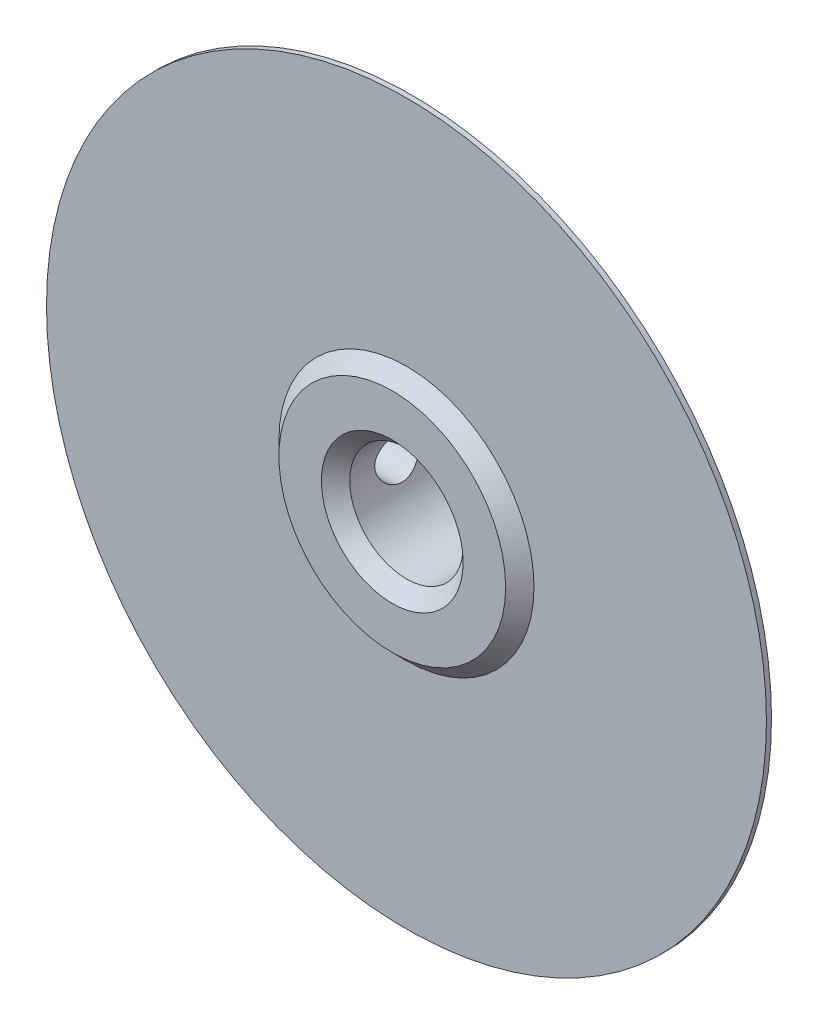
ISO-10303-21;
HEADER;
FILE_DESCRIPTION(('STEP AP214'),'2;1');
FILE_NAME('part.step','',(''),(''),'','','');
FILE_SCHEMA(('AUTOMOTIVE_DESIGN { 1 0 10303 214 1 1 1 1 }'));
ENDSEC;
DATA;
#1=APPLICATION_CONTEXT('core data for automotive mechanical design processes');
#2=APPLICATION_PROTOCOL_DEFINITION('international standard','automotive_design',2000,#1);
#3=PRODUCT_CONTEXT('',#1,'mechanical');
#4=PRODUCT('Part','Part','',(#3));
#5=PRODUCT_RELATED_PRODUCT_CATEGORY('part','',(#4));
#6=PRODUCT_DEFINITION_FORMATION('','',#4);
#7=PRODUCT_DEFINITION_CONTEXT('part definition',#1,'design');
#8=PRODUCT_DEFINITION('design','',#6,#7);
#9=PRODUCT_DEFINITION_SHAPE('','',#8);
#10=(LENGTH_UNIT() NAMED_UNIT(*) SI_UNIT(.MILLI.,.METRE.));
#11=(NAMED_UNIT(*) PLANE_ANGLE_UNIT() SI_UNIT($,.RADIAN.));
#12=(NAMED_UNIT(*) SI_UNIT($,.STERADIAN.) SOLID_ANGLE_UNIT());
#13=UNCERTAINTY_MEASURE_WITH_UNIT(LENGTH_MEASURE(1.E-05),#10,'distance_accuracy_value','');
#14=(GEOMETRIC_REPRESENTATION_CONTEXT(3) GLOBAL_UNCERTAINTY_ASSIGNED_CONTEXT((#13)) GLOBAL_UNIT_ASSIGNED_CONTEXT((#10,
#11,#12)) REPRESENTATION_CONTEXT('',''));
#15=CARTESIAN_POINT('',(0.,0.,0.));
#16=DIRECTION('',(0.,0.,1.));
#17=DIRECTION('',(1.,0.,0.));
#18=AXIS2_PLACEMENT_3D('',#15,#16,#17);
#19=CARTESIAN_POINT('',(0.,0.,0.18));
#20=DIRECTION('',(0.,0.,1.));
#21=DIRECTION('',(1.,0.,0.));
#22=AXIS2_PLACEMENT_3D('',#19,#20,#21);
#23=PLANE('',#22);
#24=CARTESIAN_POINT('',(0.,0.,0.18));
#25=DIRECTION('',(0.,0.,1.));
#26=DIRECTION('',(1.,0.,0.));
#27=AXIS2_PLACEMENT_3D('',#24,#25,#26);
#28=CIRCLE('',#27,12.7);
#29=CARTESIAN_POINT('',(-12.7,0.,0.18));
#30=VERTEX_POINT('',#29);
#31=EDGE_CURVE('E97',#30,#30,#28,.T.);
#32=ORIENTED_EDGE('',*,*,#31,.T.);
#33=EDGE_LOOP('',(#32));
#34=FACE_BOUND('',#33,.T.);
#35=CARTESIAN_POINT('',(0.,0.,0.18));
#36=DIRECTION('',(0.,0.,1.));
#37=DIRECTION('',(1.,0.,0.));
#38=AXIS2_PLACEMENT_3D('',#35,#36,#37);
#39=CIRCLE('',#38,4.5);
#40=CARTESIAN_POINT('',(4.5,0.,0.18));
#41=VERTEX_POINT('',#40);
#42=EDGE_CURVE('E75',#41,#41,#39,.T.);
#43=ORIENTED_EDGE('',*,*,#42,.F.);
#44=EDGE_LOOP('',(#43));
#45=FACE_BOUND('',#44,.T.);
#46=ADVANCED_FACE('F36',(#34,#45),#23,.T.);
#47=CARTESIAN_POINT('',(0.,0.,0.));
#48=DIRECTION('',(0.,0.,1.));
#49=DIRECTION('',(1.,0.,0.));
#50=AXIS2_PLACEMENT_3D('',#47,#48,#49);
#51=PLANE('',#50);
#52=CARTESIAN_POINT('',(0.,0.,0.));
#53=DIRECTION('',(0.,0.,1.));
#54=DIRECTION('',(1.,0.,0.));
#55=AXIS2_PLACEMENT_3D('',#52,#53,#54);
#56=CIRCLE('',#55,12.7);
#57=CARTESIAN_POINT('',(-12.7,0.,0.));
#58=VERTEX_POINT('',#57);
#59=EDGE_CURVE('E96',#58,#58,#56,.T.);
#60=ORIENTED_EDGE('',*,*,#59,.F.);
#61=EDGE_LOOP('',(#60));
#62=FACE_BOUND('',#61,.T.);
#63=CARTESIAN_POINT('',(0.,0.,0.));
#64=DIRECTION('',(0.,0.,1.));
#65=DIRECTION('',(1.,0.,0.));
#66=AXIS2_PLACEMENT_3D('',#63,#64,#65);
#67=CIRCLE('',#66,3.6);
#68=CARTESIAN_POINT('',(3.6,0.,0.));
#69=VERTEX_POINT('',#68);
#70=EDGE_CURVE('E65',#69,#69,#67,.F.);
#71=ORIENTED_EDGE('',*,*,#70,.F.);
#72=EDGE_LOOP('',(#71));
#73=FACE_BOUND('',#72,.T.);
#74=ADVANCED_FACE('F106',(#62,#73),#51,.F.);
#75=CARTESIAN_POINT('',(0.,0.,0.18));
#76=DIRECTION('',(0.,0.,-1.));
#77=DIRECTION('',(-1.,0.,0.));
#78=AXIS2_PLACEMENT_3D('',#75,#76,#77);
#79=CYLINDRICAL_SURFACE('',#78,12.7);
#80=CARTESIAN_POINT('',(-12.7,0.,0.18));
#81=CARTESIAN_POINT('',(-12.7,0.,0.178125));
#82=CARTESIAN_POINT('',(-12.7,0.,0.17625));
#83=CARTESIAN_POINT('',(-12.7,0.,0.1725));
#84=CARTESIAN_POINT('',(-12.7,0.,0.170625));
#85=CARTESIAN_POINT('',(-12.7,0.,0.166875));
#86=CARTESIAN_POINT('',(-12.7,0.,0.165));
#87=CARTESIAN_POINT('',(-12.7,0.,0.16125));
#88=CARTESIAN_POINT('',(-12.7,0.,0.159375));
#89=CARTESIAN_POINT('',(-12.7,0.,0.155625));
#90=CARTESIAN_POINT('',(-12.7,0.,0.15375));
#91=CARTESIAN_POINT('',(-12.7,0.,0.15));
#92=CARTESIAN_POINT('',(-12.7,0.,0.148125));
#93=CARTESIAN_POINT('',(-12.7,0.,0.144375));
#94=CARTESIAN_POINT('',(-12.7,0.,0.1425));
#95=CARTESIAN_POINT('',(-12.7,0.,0.13875));
#96=CARTESIAN_POINT('',(-12.7,0.,0.136875));
#97=CARTESIAN_POINT('',(-12.7,0.,0.133125));
#98=CARTESIAN_POINT('',(-12.7,0.,0.13125));
#99=CARTESIAN_POINT('',(-12.7,0.,0.1275));
#100=CARTESIAN_POINT('',(-12.7,0.,0.125625));
#101=CARTESIAN_POINT('',(-12.7,0.,0.121875));
#102=CARTESIAN_POINT('',(-12.7,0.,0.12));
#103=CARTESIAN_POINT('',(-12.7,0.,0.11625));
#104=CARTESIAN_POINT('',(-12.7,0.,0.114375));
#105=CARTESIAN_POINT('',(-12.7,0.,0.110625));
#106=CARTESIAN_POINT('',(-12.7,0.,0.10875));
#107=CARTESIAN_POINT('',(-12.7,0.,0.105));
#108=CARTESIAN_POINT('',(-12.7,0.,0.103125));
#109=CARTESIAN_POINT('',(-12.7,0.,0.099375));
#110=CARTESIAN_POINT('',(-12.7,0.,0.0975));
#111=CARTESIAN_POINT('',(-12.7,0.,0.09375));
#112=CARTESIAN_POINT('',(-12.7,0.,0.091875));
#113=CARTESIAN_POINT('',(-12.7,0.,0.088125));
#114=CARTESIAN_POINT('',(-12.7,0.,0.08625));
#115=CARTESIAN_POINT('',(-12.7,0.,0.0825));
#116=CARTESIAN_POINT('',(-12.7,0.,0.080625));
#117=CARTESIAN_POINT('',(-12.7,0.,0.076875));
#118=CARTESIAN_POINT('',(-12.7,0.,0.075));
#119=CARTESIAN_POINT('',(-12.7,0.,0.07125));
#120=CARTESIAN_POINT('',(-12.7,0.,0.069375));
#121=CARTESIAN_POINT('',(-12.7,0.,0.065625));
#122=CARTESIAN_POINT('',(-12.7,0.,0.06375));
#123=CARTESIAN_POINT('',(-12.7,0.,0.06));
#124=CARTESIAN_POINT('',(-12.7,0.,0.058125));
#125=CARTESIAN_POINT('',(-12.7,0.,0.054375));
#126=CARTESIAN_POINT('',(-12.7,0.,0.0525));
#127=CARTESIAN_POINT('',(-12.7,0.,0.04875));
#128=CARTESIAN_POINT('',(-12.7,0.,0.046875));
#129=CARTESIAN_POINT('',(-12.7,0.,0.043125));
#130=CARTESIAN_POINT('',(-12.7,0.,0.04125));
#131=CARTESIAN_POINT('',(-12.7,0.,0.0375));
#132=CARTESIAN_POINT('',(-12.7,0.,0.035625));
#133=CARTESIAN_POINT('',(-12.7,0.,0.031875));
#134=CARTESIAN_POINT('',(-12.7,0.,0.03));
#135=CARTESIAN_POINT('',(-12.7,0.,0.02625));
#136=CARTESIAN_POINT('',(-12.7,0.,0.024375));
#137=CARTESIAN_POINT('',(-12.7,0.,0.020625));
#138=CARTESIAN_POINT('',(-12.7,0.,0.01875));
#139=CARTESIAN_POINT('',(-12.7,0.,0.015));
#140=CARTESIAN_POINT('',(-12.7,0.,0.013125));
#141=CARTESIAN_POINT('',(-12.7,0.,0.00937499999999997));
#142=CARTESIAN_POINT('',(-12.7,0.,0.00749999999999997));
#143=CARTESIAN_POINT('',(-12.7,0.,0.00374999999999996));
#144=CARTESIAN_POINT('',(-12.7,0.,0.00187499999999997));
#145=CARTESIAN_POINT('',(-12.7,0.,0.));
#146=B_SPLINE_CURVE_WITH_KNOTS('',3,(#80,#81,#82,#83,#84,#85,#86,#87,#88,#89,#90,#91,#92,#93,
#94,#95,#96,#97,#98,#99,#100,#101,#102,#103,#104,#105,#106,#107,#108,#109,#110,#111,#112,#113,
#114,#115,#116,#117,#118,#119,#120,#121,#122,#123,#124,#125,#126,#127,#128,#129,#130,#131,#132,
#133,#134,#135,#136,#137,#138,#139,#140,#141,#142,#143,#144,#145),.UNSPECIFIED.,.F.,.F.,(4,2,2,
2,2,2,2,2,2,2,2,2,2,2,2,2,2,2,2,2,2,2,2,2,2,2,2,2,2,2,2,2,4),(0.,0.00562500000000001,0.01125,
0.016875,0.0225,0.028125,0.03375,0.039375,0.045,0.050625,0.05625,0.061875,0.0675,0.073125,
0.07875,0.084375,0.09,0.095625,0.10125,0.106875,0.1125,0.118125,0.12375,0.129375,0.135,0.140625,
0.14625,0.151875,0.1575,0.163125,0.16875,0.174375,0.18),.UNSPECIFIED.);
#147=EDGE_CURVE('BSEAM103',#30,#58,#146,.T.);
#148=ORIENTED_EDGE('',*,*,#31,.F.);
#149=ORIENTED_EDGE('',*,*,#59,.T.);
#150=ORIENTED_EDGE('',*,*,#147,.T.);
#151=ORIENTED_EDGE('',*,*,#147,.F.);
#152=EDGE_LOOP('',(#148,#150,#149,#151));
#153=FACE_BOUND('',#152,.T.);
#154=ADVANCED_FACE('F103',(#153),#79,.T.);
#155=CARTESIAN_POINT('',(0.,0.,0.18));
#156=DIRECTION('',(0.,0.,-1.));
#157=DIRECTION('',(-1.,0.,0.));
#158=AXIS2_PLACEMENT_3D('',#155,#156,#157);
#159=CYLINDRICAL_SURFACE('',#158,2.);
#160=CARTESIAN_POINT('',(0.,0.,0.179999999999991));
#161=DIRECTION('',(0.,0.,1.));
#162=DIRECTION('',(1.,0.,0.));
#163=AXIS2_PLACEMENT_3D('',#160,#161,#162);
#164=CIRCLE('',#163,2.);
#165=CARTESIAN_POINT('',(2.,0.,0.179999999999991));
#166=VERTEX_POINT('',#165);
#167=EDGE_CURVE('E43',#166,#166,#164,.T.);
#168=ORIENTED_EDGE('',*,*,#167,.T.);
#169=EDGE_LOOP('',(#168));
#170=FACE_BOUND('',#169,.T.);
#171=CARTESIAN_POINT('',(0.,0.,-2.5));
#172=DIRECTION('',(0.,0.,-1.));
#173=DIRECTION('',(-1.,0.,0.));
#174=AXIS2_PLACEMENT_3D('',#171,#172,#173);
#175=CIRCLE('',#174,2.);
#176=CARTESIAN_POINT('',(-2.,0.,-2.5));
#177=VERTEX_POINT('',#176);
#178=EDGE_CURVE('E62',#177,#177,#175,.T.);
#179=ORIENTED_EDGE('',*,*,#178,.T.);
#180=EDGE_LOOP('',(#179));
#181=FACE_BOUND('',#180,.T.);
#182=CARTESIAN_POINT('',(-2.,0.,-0.7));
#183=CARTESIAN_POINT('',(-1.99999708490834,-0.0429972021771565,-0.70000394072949));
#184=CARTESIAN_POINT('',(-1.99859717722773,-0.0860690256362693,-0.70348710083535));
#185=CARTESIAN_POINT('',(-1.99313381240257,-0.170998592167158,-0.717299081408494));
#186=CARTESIAN_POINT('',(-1.98906311479551,-0.212852711024499,-0.727646511634453));
#187=CARTESIAN_POINT('',(-1.97869683685247,-0.293981569090961,-0.754750431223532));
#188=CARTESIAN_POINT('',(-1.97240854545629,-0.333264264646783,-0.771485938486692));
#189=CARTESIAN_POINT('',(-1.95822644318431,-0.408428788131347,-0.810807669330618));
#190=CARTESIAN_POINT('',(-1.95033318983223,-0.444311790700397,-0.833391861967572));
#191=CARTESIAN_POINT('',(-1.93332354468167,-0.513400403028157,-0.884894199424375));
#192=CARTESIAN_POINT('',(-1.92416918771676,-0.546424909020085,-0.914042662496106));
#193=CARTESIAN_POINT('',(-1.90584230762478,-0.607270001913889,-0.977360001390711));
#194=CARTESIAN_POINT('',(-1.89666977781517,-0.635088042853413,-1.0115313188847));
#195=CARTESIAN_POINT('',(-1.87889116718855,-0.685949826917151,-1.08577122809691));
#196=CARTESIAN_POINT('',(-1.87032846385981,-0.708725992478189,-1.12603459440928));
#197=CARTESIAN_POINT('',(-1.85533458874717,-0.747101887614859,-1.21021455936802));
#198=CARTESIAN_POINT('',(-1.8489024049767,-0.762705025714334,-1.25412941113934));
#199=CARTESIAN_POINT('',(-1.83930543064327,-0.785559529358347,-1.34228493343684));
#200=CARTESIAN_POINT('',(-1.83600568142242,-0.793157586322259,-1.38642049423048));
#201=CARTESIAN_POINT('',(-1.83265601619658,-0.800869184656011,-1.47545399932291));
#202=CARTESIAN_POINT('',(-1.83260450209107,-0.800986406525289,-1.52035155785001));
#203=CARTESIAN_POINT('',(-1.83564200111998,-0.793995747001818,-1.60630266858322));
#204=CARTESIAN_POINT('',(-1.8385127001538,-0.787390125722055,-1.64740628576361));
#205=CARTESIAN_POINT('',(-1.84670475043134,-0.767978752119128,-1.72786382240269));
#206=CARTESIAN_POINT('',(-1.85202652928669,-0.755171917921852,-1.76721743524412));
#207=CARTESIAN_POINT('',(-1.86463794035412,-0.723477893020429,-1.84400713447842));
#208=CARTESIAN_POINT('',(-1.87196551712315,-0.704471944926127,-1.88138769562188));
#209=CARTESIAN_POINT('',(-1.88775246555956,-0.661002584292885,-1.95256632654463));
#210=CARTESIAN_POINT('',(-1.89621226182739,-0.636537122040337,-1.98636304376112));
#211=CARTESIAN_POINT('',(-1.91410694696908,-0.580620239781773,-2.0521638915208));
#212=CARTESIAN_POINT('',(-1.92356665990461,-0.548774985188254,-2.08382749177841));
#213=CARTESIAN_POINT('',(-1.94183929983313,-0.480125770972077,-2.14147379120082));
#214=CARTESIAN_POINT('',(-1.9506520977813,-0.443320826133773,-2.16745535896412));
#215=CARTESIAN_POINT('',(-1.96685872505819,-0.364831061042337,-2.21344697896633));
#216=CARTESIAN_POINT('',(-1.97422108038166,-0.323064196538591,-2.23332891247882));
#217=CARTESIAN_POINT('',(-1.98645931331504,-0.236409506193153,-2.26566714443122));
#218=CARTESIAN_POINT('',(-1.99133645384953,-0.19152327873987,-2.27812721502296));
#219=CARTESIAN_POINT('',(-1.99782455802764,-0.102758355043128,-2.29457931816788));
#220=CARTESIAN_POINT('',(-1.99961178333406,-0.0589773175942141,-2.29902898170142));
#221=CARTESIAN_POINT('',(-2.00027391404252,0.0287381239231266,-2.30068524021145));
#222=CARTESIAN_POINT('',(-1.99914957432917,0.0726724852895693,-2.297893712619));
#223=CARTESIAN_POINT('',(-1.99423026825501,0.157373095648795,-2.2854832989792));
#224=CARTESIAN_POINT('',(-1.99055756538209,0.198192996710189,-2.27617680785961));
#225=CARTESIAN_POINT('',(-1.981037765622,0.277654171224312,-2.25142571667607));
#226=CARTESIAN_POINT('',(-1.97519038942612,0.316295164089937,-2.23598032813253));
#227=CARTESIAN_POINT('',(-1.96166637908325,0.391631514326681,-2.19888602412802));
#228=CARTESIAN_POINT('',(-1.95393926391921,0.428231209102162,-2.17706181118274));
#229=CARTESIAN_POINT('',(-1.9374934589821,0.497377436498622,-2.12802387043774));
#230=CARTESIAN_POINT('',(-1.92877437244108,0.52992233630445,-2.10080798283095));
#231=CARTESIAN_POINT('',(-1.91058047055245,0.592289217211527,-2.03965199482015));
#232=CARTESIAN_POINT('',(-1.90109376570021,0.621789573522426,-2.00538658339752));
#233=CARTESIAN_POINT('',(-1.88296669166853,0.674700478965484,-1.93222396679625));
#234=CARTESIAN_POINT('',(-1.87432646210604,0.698110024535003,-1.89332599986402));
#235=CARTESIAN_POINT('',(-1.85885719963083,0.738323000772651,-1.81141532216236));
#236=CARTESIAN_POINT('',(-1.85204652353915,0.755060237813781,-1.76836640031508));
#237=CARTESIAN_POINT('',(-1.84129469391173,0.780918487882122,-1.67970653931394));
#238=CARTESIAN_POINT('',(-1.83735142278399,0.790045122107726,-1.63409751767503));
#239=CARTESIAN_POINT('',(-1.83308703719971,0.79988624691136,-1.54514883929018));
#240=CARTESIAN_POINT('',(-1.83252568403269,0.801158832921147,-1.50188206416266));
#241=CARTESIAN_POINT('',(-1.83445934413239,0.796721263711009,-1.41578205691468));
#242=CARTESIAN_POINT('',(-1.83695396929917,0.791011995165513,-1.37294877043897));
#243=CARTESIAN_POINT('',(-1.84450659631608,0.773228546461459,-1.29066712405798));
#244=CARTESIAN_POINT('',(-1.8494593273098,0.761414997428391,-1.2511518902268));
#245=CARTESIAN_POINT('',(-1.86129600493079,0.732002179396405,-1.17464854815461));
#246=CARTESIAN_POINT('',(-1.86818048482403,0.714401312557525,-1.13766114124007));
#247=CARTESIAN_POINT('',(-1.88359443841797,0.672749105103892,-1.06495615229169));
#248=CARTESIAN_POINT('',(-1.89219552925297,0.648386134063796,-1.02943253194781));
#249=CARTESIAN_POINT('',(-1.90985521748895,0.594356847708598,-0.962802673118498));
#250=CARTESIAN_POINT('',(-1.91891395219363,0.564688933927249,-0.931697771148674));
#251=CARTESIAN_POINT('',(-1.93717426834958,0.498602202508985,-0.872718858694554));
#252=CARTESIAN_POINT('',(-1.94634703184874,0.461870400458455,-0.845185077240773));
#253=CARTESIAN_POINT('',(-1.96320162685487,0.383960128114312,-0.796665182951346));
#254=CARTESIAN_POINT('',(-1.97088276437162,0.342779601818895,-0.775682115138989));
#255=CARTESIAN_POINT('',(-1.98375885926344,0.257895224998081,-0.741351113923884));
#256=CARTESIAN_POINT('',(-1.98899745222011,0.214252647287879,-0.727868270575865));
#257=CARTESIAN_POINT('',(-1.99657722483746,0.125150618512488,-0.708544351618293));
#258=CARTESIAN_POINT('',(-1.99892759798255,0.0796974103435651,-0.70267902530244));
#259=CARTESIAN_POINT('',(-1.99990359801655,0.0227649191563719,-0.70024184760869));
#260=CARTESIAN_POINT('',(-2.0000007718767,0.0113850754963034,-0.699998956548322));
#261=CARTESIAN_POINT('',(-2.,0.,-0.7));
#262=B_SPLINE_CURVE_WITH_KNOTS('',3,(#182,#183,#184,#185,#186,#187,#188,#189,#190,#191,#192,
#193,#194,#195,#196,#197,#198,#199,#200,#201,#202,#203,#204,#205,#206,#207,#208,#209,#210,#211,
#212,#213,#214,#215,#216,#217,#218,#219,#220,#221,#222,#223,#224,#225,#226,#227,#228,#229,#230,
#231,#232,#233,#234,#235,#236,#237,#238,#239,#240,#241,#242,#243,#244,#245,#246,#247,#248,#249,
#250,#251,#252,#253,#254,#255,#256,#257,#258,#259,#260,#261),.UNSPECIFIED.,.T.,.F.,(4,2,2,2,2,2,
2,2,2,2,2,2,2,2,2,2,2,2,2,2,2,2,2,2,2,2,2,2,2,2,2,2,2,2,2,2,2,2,2,4),(0.,0.128961195157228,
0.258273454403174,0.387164582988632,0.516011014271937,0.650389526801588,0.784833579737646,
0.925261035276867,1.06562169247307,1.19961642123531,1.33354522536195,1.45815331360549,
1.58278314902419,1.70995650519526,1.83717768775273,1.97423339674623,2.11131637135893,
2.25110765265123,2.39082782445516,2.52227673811203,2.65369157428033,2.77920182225746,
2.90472819597519,3.03409405359305,3.16351183799588,3.30147389849765,3.43945867617499,
3.57878018056331,3.71799869058374,3.84719869357099,3.97638229025218,4.10045727419508,
4.22456654322065,4.35578187222677,4.48703680539357,4.62680169413534,4.76663145456213,
4.90385720405328,5.04064500961737,5.07479218358718),.UNSPECIFIED.);
#263=CARTESIAN_POINT('',(-2.,0.,-0.7));
#264=VERTEX_POINT('',#263);
#265=EDGE_CURVE('E74',#264,#264,#262,.T.);
#266=ORIENTED_EDGE('',*,*,#265,.F.);
#267=EDGE_LOOP('',(#266));
#268=FACE_BOUND('',#267,.T.);
#269=ADVANCED_FACE('F99',(#170,#181,#268),#159,.F.);
#270=CARTESIAN_POINT('',(0.,0.,-3.));
#271=DIRECTION('',(0.,0.,-1.));
#272=DIRECTION('',(-1.,0.,0.));
#273=AXIS2_PLACEMENT_3D('',#270,#271,#272);
#274=PLANE('',#273);
#275=CARTESIAN_POINT('',(0.,0.,-3.));
#276=DIRECTION('',(0.,0.,-1.));
#277=DIRECTION('',(-1.,0.,0.));
#278=AXIS2_PLACEMENT_3D('',#275,#276,#277);
#279=CIRCLE('',#278,2.50000000000001);
#280=CARTESIAN_POINT('',(-2.50000000000001,0.,-3.));
#281=VERTEX_POINT('',#280);
#282=EDGE_CURVE('E56',#281,#281,#279,.F.);
#283=ORIENTED_EDGE('',*,*,#282,.T.);
#284=EDGE_LOOP('',(#283));
#285=FACE_BOUND('',#284,.T.);
#286=CARTESIAN_POINT('',(0.,0.,-3.));
#287=DIRECTION('',(0.,0.,-1.));
#288=DIRECTION('',(-1.,0.,0.));
#289=AXIS2_PLACEMENT_3D('',#286,#287,#288);
#290=CIRCLE('',#289,3.1);
#291=CARTESIAN_POINT('',(-3.1,0.,-3.));
#292=VERTEX_POINT('',#291);
#293=EDGE_CURVE('E59',#292,#292,#290,.T.);
#294=ORIENTED_EDGE('',*,*,#293,.T.);
#295=EDGE_LOOP('',(#294));
#296=FACE_BOUND('',#295,.T.);
#297=ADVANCED_FACE('F88',(#285,#296),#274,.T.);
#298=CARTESIAN_POINT('',(0.,0.,-3.));
#299=DIRECTION('',(0.,0.,1.));
#300=DIRECTION('',(1.,0.,0.));
#301=AXIS2_PLACEMENT_3D('',#298,#299,#300);
#302=CYLINDRICAL_SURFACE('',#301,3.6);
#303=CARTESIAN_POINT('',(0.,0.,-2.5));
#304=DIRECTION('',(0.,0.,-1.));
#305=DIRECTION('',(-1.,0.,0.));
#306=AXIS2_PLACEMENT_3D('',#303,#304,#305);
#307=CIRCLE('',#306,3.6);
#308=CARTESIAN_POINT('',(-3.6,0.,-2.5));
#309=VERTEX_POINT('',#308);
#310=EDGE_CURVE('E51',#309,#309,#307,.F.);
#311=ORIENTED_EDGE('',*,*,#310,.T.);
#312=EDGE_LOOP('',(#311));
#313=FACE_BOUND('',#312,.T.);
#314=CARTESIAN_POINT('',(-3.6,0.,-2.3));
#315=CARTESIAN_POINT('',(-3.59999918487301,0.0443521907102593,-2.29999851052807));
#316=CARTESIAN_POINT('',(-3.59917205598277,0.0887222261078481,-2.2962992073346));
#317=CARTESIAN_POINT('',(-3.59595239103068,0.176200777641254,-2.28161581105978));
#318=CARTESIAN_POINT('',(-3.59355876086939,0.219308390055595,-2.27062662639629));
#319=CARTESIAN_POINT('',(-3.58747245267603,0.302985311104611,-2.24172561180334));
#320=CARTESIAN_POINT('',(-3.58378115375633,0.343557260840114,-2.22382112920085));
#321=CARTESIAN_POINT('',(-3.57549734176551,0.421120072125504,-2.18162135501104));
#322=CARTESIAN_POINT('',(-3.57090484618943,0.458111003173338,-2.15732618748375));
#323=CARTESIAN_POINT('',(-3.56123637669684,0.528074525605614,-2.10260973395733));
#324=CARTESIAN_POINT('',(-3.55615424656571,0.560979444817414,-2.07210299914594));
#325=CARTESIAN_POINT('',(-3.54612240431915,0.621249964183348,-2.00601277596274));
#326=CARTESIAN_POINT('',(-3.5411727043522,0.648615057643421,-1.97042882371582));
#327=CARTESIAN_POINT('',(-3.53190531304685,0.697329773641402,-1.89469126237668));
#328=CARTESIAN_POINT('',(-3.52759550297193,0.718606968417614,-1.85449001678339));
#329=CARTESIAN_POINT('',(-3.52018438540958,0.754077195818032,-1.77097089532303));
#330=CARTESIAN_POINT('',(-3.51708292841909,0.768271104880384,-1.7276534057983));
#331=CARTESIAN_POINT('',(-3.51250243783675,0.788947432025617,-1.63986660907093));
#332=CARTESIAN_POINT('',(-3.51099818323113,0.795549868152275,-1.59542691395783));
#333=CARTESIAN_POINT('',(-3.50970669492268,0.801229083990692,-1.50604711288552));
#334=CARTESIAN_POINT('',(-3.50991924311575,0.800306819646652,-1.46110707121514));
#335=CARTESIAN_POINT('',(-3.51201452859258,0.791059310069207,-1.37289734912248));
#336=CARTESIAN_POINT('',(-3.51386572553936,0.782873857840868,-1.32961215034426));
#337=CARTESIAN_POINT('',(-3.5189798167667,0.759553962724584,-1.24504514267));
#338=CARTESIAN_POINT('',(-3.52224279253271,0.744419118726606,-1.20376344956584));
#339=CARTESIAN_POINT('',(-3.52984363988119,0.707502691491499,-1.12398422464725));
#340=CARTESIAN_POINT('',(-3.53419009744996,0.685667677517411,-1.08551226906557));
#341=CARTESIAN_POINT('',(-3.54346295164297,0.636008272559398,-1.01272685179364));
#342=CARTESIAN_POINT('',(-3.54838942968239,0.608183040297097,-0.978413975271942));
#343=CARTESIAN_POINT('',(-3.55840229845066,0.546594734811931,-0.914116276260612));
#344=CARTESIAN_POINT('',(-3.56348980275149,0.512712882106493,-0.884245285957977));
#345=CARTESIAN_POINT('',(-3.57315135648927,0.440362647236648,-0.830590508437153));
#346=CARTESIAN_POINT('',(-3.57772539603371,0.401894176734948,-0.806806838487242));
#347=CARTESIAN_POINT('',(-3.58586025693443,0.321321276293894,-0.765972289689276));
#348=CARTESIAN_POINT('',(-3.58941877203064,0.279208848927941,-0.748936702276697));
#349=CARTESIAN_POINT('',(-3.59510454546502,0.192622372392582,-0.722215594776851));
#350=CARTESIAN_POINT('',(-3.59723201878714,0.148148679037346,-0.71252897063435));
#351=CARTESIAN_POINT('',(-3.59978527104669,0.0590781933123378,-0.700947194697931));
#352=CARTESIAN_POINT('',(-3.60024499448916,0.014502558927562,-0.698896599935327));
#353=CARTESIAN_POINT('',(-3.59950623460239,-0.0743543695712318,-0.702223241704148));
#354=CARTESIAN_POINT('',(-3.59830786756184,-0.118635684108258,-0.707599957327778));
#355=CARTESIAN_POINT('',(-3.59440903503445,-0.205129302931769,-0.72549976606724));
#356=CARTESIAN_POINT('',(-3.59172578803104,-0.247359396686194,-0.73794098248938));
#357=CARTESIAN_POINT('',(-3.58515768434718,-0.329133122342333,-0.76952547497803));
#358=CARTESIAN_POINT('',(-3.58127272305864,-0.368676520004071,-0.788669334522402));
#359=CARTESIAN_POINT('',(-3.57264861291056,-0.444594575957752,-0.833437150719594));
#360=CARTESIAN_POINT('',(-3.56789777836099,-0.480914292332899,-0.859151977202465));
#361=CARTESIAN_POINT('',(-3.55809212939632,-0.548778785995248,-0.916212499640575));
#362=CARTESIAN_POINT('',(-3.5530372742007,-0.580322920693651,-0.94755895213284));
#363=CARTESIAN_POINT('',(-3.54307551578324,-0.638358192763942,-1.01570721343228));
#364=CARTESIAN_POINT('',(-3.53817327065714,-0.664741527760293,-1.05260163600264));
#365=CARTESIAN_POINT('',(-3.52918158151324,-0.710938447691008,-1.13038881376433));
#366=CARTESIAN_POINT('',(-3.52509210198108,-0.730752319707894,-1.17128139413684));
#367=CARTESIAN_POINT('',(-3.5182288021957,-0.763112007585036,-1.25568331564205));
#368=CARTESIAN_POINT('',(-3.51544751863915,-0.775699145419036,-1.29917617690754));
#369=CARTESIAN_POINT('',(-3.51150259878957,-0.793368110633623,-1.38772967394499));
#370=CARTESIAN_POINT('',(-3.51033869418933,-0.798451182873425,-1.43279004841038));
#371=CARTESIAN_POINT('',(-3.50977760579591,-0.800913426564176,-1.52211155131133));
#372=CARTESIAN_POINT('',(-3.5103411934805,-0.798463652575734,-1.56636780322402));
#373=CARTESIAN_POINT('',(-3.51308265983019,-0.786313108486751,-1.65381988398673));
#374=CARTESIAN_POINT('',(-3.51526051818813,-0.776612429600958,-1.69701572616939));
#375=CARTESIAN_POINT('',(-3.5209657125261,-0.750319279922977,-1.78097964809095));
#376=CARTESIAN_POINT('',(-3.52448802073108,-0.733752466513814,-1.82175612675264));
#377=CARTESIAN_POINT('',(-3.53248705787623,-0.694219081393368,-1.89997599701869));
#378=CARTESIAN_POINT('',(-3.53696388990653,-0.671251818340774,-1.9374190279856));
#379=CARTESIAN_POINT('',(-3.54648417134132,-0.619005435962232,-2.00875064357919));
#380=CARTESIAN_POINT('',(-3.55153748547096,-0.589604742044153,-2.04254888196906));
#381=CARTESIAN_POINT('',(-3.56157589669355,-0.525571482378016,-2.10478802957253));
#382=CARTESIAN_POINT('',(-3.56656097771621,-0.490937706493374,-2.13322769620337));
#383=CARTESIAN_POINT('',(-3.57598103890633,-0.416858388258226,-2.18431039316797));
#384=CARTESIAN_POINT('',(-3.58040769399691,-0.377354254653979,-2.20687007989397));
#385=CARTESIAN_POINT('',(-3.588128233477,-0.295024111911527,-2.24499332167248));
#386=CARTESIAN_POINT('',(-3.59142305308326,-0.252200881325198,-2.26056265601847));
#387=CARTESIAN_POINT('',(-3.59593125163822,-0.174455299091764,-2.28153654011072));
#388=CARTESIAN_POINT('',(-3.59744747609284,-0.139948796760673,-2.28844694946651));
#389=CARTESIAN_POINT('',(-3.59948214983916,-0.0702985799578111,-2.29767916172246));
#390=CARTESIAN_POINT('',(-3.60000064609445,-0.0351548955571512,-2.30000118060076));
#391=CARTESIAN_POINT('',(-3.6,0.,-2.3));
#392=B_SPLINE_CURVE_WITH_KNOTS('',3,(#314,#315,#316,#317,#318,#319,#320,#321,#322,#323,#324,
#325,#326,#327,#328,#329,#330,#331,#332,#333,#334,#335,#336,#337,#338,#339,#340,#341,#342,#343,
#344,#345,#346,#347,#348,#349,#350,#351,#352,#353,#354,#355,#356,#357,#358,#359,#360,#361,#362,
#363,#364,#365,#366,#367,#368,#369,#370,#371,#372,#373,#374,#375,#376,#377,#378,#379,#380,#381,
#382,#383,#384,#385,#386,#387,#388,#389,#390,#391),.UNSPECIFIED.,.T.,.F.,(4,2,2,2,2,2,2,2,2,2,2,
2,2,2,2,2,2,2,2,2,2,2,2,2,2,2,2,2,2,2,2,2,2,2,2,2,2,2,4),(0.,0.132927875891919,
0.265948692499713,0.398828564962983,0.531705858067956,0.666552288008315,0.801411045962056,
0.937813185191903,1.07419844275096,1.20839650255243,1.34257751398636,1.47423067258313,
1.60589143098776,1.73863067883833,1.8713885810332,2.00711271923591,2.14283947187931,
2.27887205124495,2.41488419000795,2.54811196849707,2.68133040364907,2.81303547770067,
2.94475201978184,3.07839921304817,3.21206437355103,3.34827789242291,3.48448545804165,
3.61990623622097,3.75530454674564,3.88765114056967,4.01999606953144,4.15185084806312,
4.28371987434554,4.4183373052513,4.55298591386564,4.68945034819827,4.82580175148374,
4.93116938943423,5.0365320675518),.UNSPECIFIED.);
#393=CARTESIAN_POINT('',(-3.6,0.,-2.3));
#394=VERTEX_POINT('',#393);
#395=EDGE_CURVE('E66',#394,#394,#392,.T.);
#396=ORIENTED_EDGE('',*,*,#395,.T.);
#397=EDGE_LOOP('',(#396));
#398=FACE_BOUND('',#397,.T.);
#399=ORIENTED_EDGE('',*,*,#70,.T.);
#400=EDGE_LOOP('',(#399));
#401=FACE_BOUND('',#400,.T.);
#402=ADVANCED_FACE('F77',(#313,#398,#401),#302,.T.);
#403=CARTESIAN_POINT('',(-10.,0.,-1.5));
#404=DIRECTION('',(1.,0.,0.));
#405=DIRECTION('',(0.,0.,-1.));
#406=AXIS2_PLACEMENT_3D('',#403,#404,#405);
#407=CYLINDRICAL_SURFACE('',#406,0.8);
#408=ORIENTED_EDGE('',*,*,#265,.T.);
#409=EDGE_LOOP('',(#408));
#410=FACE_BOUND('',#409,.T.);
#411=ORIENTED_EDGE('',*,*,#395,.F.);
#412=EDGE_LOOP('',(#411));
#413=FACE_BOUND('',#412,.T.);
#414=ADVANCED_FACE('F81',(#410,#413),#407,.F.);
#415=CARTESIAN_POINT('',(0.,0.,-2.5));
#416=DIRECTION('',(0.,0.,-1.));
#417=DIRECTION('',(-1.,0.,0.));
#418=AXIS2_PLACEMENT_3D('',#415,#416,#417);
#419=CONICAL_SURFACE('',#418,2.,0.785398163397452);
#420=ORIENTED_EDGE('',*,*,#282,.F.);
#421=EDGE_LOOP('',(#420));
#422=FACE_BOUND('',#421,.T.);
#423=ORIENTED_EDGE('',*,*,#178,.F.);
#424=EDGE_LOOP('',(#423));
#425=FACE_BOUND('',#424,.T.);
#426=ADVANCED_FACE('F85',(#422,#425),#419,.F.);
#427=CARTESIAN_POINT('',(0.,0.,-3.));
#428=DIRECTION('',(0.,0.,1.));
#429=DIRECTION('',(1.,0.,0.));
#430=AXIS2_PLACEMENT_3D('',#427,#428,#429);
#431=CONICAL_SURFACE('',#430,3.1,0.785398163397447);
#432=ORIENTED_EDGE('',*,*,#310,.F.);
#433=EDGE_LOOP('',(#432));
#434=FACE_BOUND('',#433,.T.);
#435=ORIENTED_EDGE('',*,*,#293,.F.);
#436=EDGE_LOOP('',(#435));
#437=FACE_BOUND('',#436,.T.);
#438=ADVANCED_FACE('F116',(#434,#437),#431,.T.);
#439=CARTESIAN_POINT('',(0.,0.,0.68));
#440=DIRECTION('',(0.,0.,1.));
#441=DIRECTION('',(1.,0.,0.));
#442=AXIS2_PLACEMENT_3D('',#439,#440,#441);
#443=PLANE('',#442);
#444=CARTESIAN_POINT('',(0.,0.,0.68));
#445=DIRECTION('',(0.,0.,1.));
#446=DIRECTION('',(1.,0.,0.));
#447=AXIS2_PLACEMENT_3D('',#444,#445,#446);
#448=CIRCLE('',#447,2.50000000000001);
#449=CARTESIAN_POINT('',(2.50000000000001,0.,0.68));
#450=VERTEX_POINT('',#449);
#451=EDGE_CURVE('E11',#450,#450,#448,.F.);
#452=ORIENTED_EDGE('',*,*,#451,.T.);
#453=EDGE_LOOP('',(#452));
#454=FACE_BOUND('',#453,.T.);
#455=CARTESIAN_POINT('',(0.,0.,0.68));
#456=DIRECTION('',(0.,0.,1.));
#457=DIRECTION('',(1.,0.,0.));
#458=AXIS2_PLACEMENT_3D('',#455,#456,#457);
#459=CIRCLE('',#458,4.);
#460=CARTESIAN_POINT('',(4.,0.,0.68));
#461=VERTEX_POINT('',#460);
#462=EDGE_CURVE('E47',#461,#461,#459,.T.);
#463=ORIENTED_EDGE('',*,*,#462,.T.);
#464=EDGE_LOOP('',(#463));
#465=FACE_BOUND('',#464,.T.);
#466=ADVANCED_FACE('F87',(#454,#465),#443,.T.);
#467=CARTESIAN_POINT('',(0.,0.,0.68));
#468=DIRECTION('',(0.,0.,-1.));
#469=DIRECTION('',(-1.,0.,0.));
#470=AXIS2_PLACEMENT_3D('',#467,#468,#469);
#471=CONICAL_SURFACE('',#470,4.,0.785398163397447);
#472=ORIENTED_EDGE('',*,*,#42,.T.);
#473=EDGE_LOOP('',(#472));
#474=FACE_BOUND('',#473,.T.);
#475=ORIENTED_EDGE('',*,*,#462,.F.);
#476=EDGE_LOOP('',(#475));
#477=FACE_BOUND('',#476,.T.);
#478=ADVANCED_FACE('F120',(#474,#477),#471,.T.);
#479=CARTESIAN_POINT('',(0.,0.,0.179999999999991));
#480=DIRECTION('',(0.,0.,1.));
#481=DIRECTION('',(1.,0.,0.));
#482=AXIS2_PLACEMENT_3D('',#479,#480,#481);
#483=CONICAL_SURFACE('',#482,2.,0.785398163397452);
#484=ORIENTED_EDGE('',*,*,#451,.F.);
#485=EDGE_LOOP('',(#484));
#486=FACE_BOUND('',#485,.T.);
#487=ORIENTED_EDGE('',*,*,#167,.F.);
#488=EDGE_LOOP('',(#487));
#489=FACE_BOUND('',#488,.T.);
#490=ADVANCED_FACE('F38',(#486,#489),#483,.F.);
#491=CLOSED_SHELL('',(#46,#74,#154,#269,#297,#402,#414,#426,#438,#466,#478,#490));
#492=MANIFOLD_SOLID_BREP('B2',#491);
#493=ADVANCED_BREP_SHAPE_REPRESENTATION('',(#18,#492),#14);
#494=SHAPE_DEFINITION_REPRESENTATION(#9,#493);
ENDSEC;
END-ISO-10303-21;
